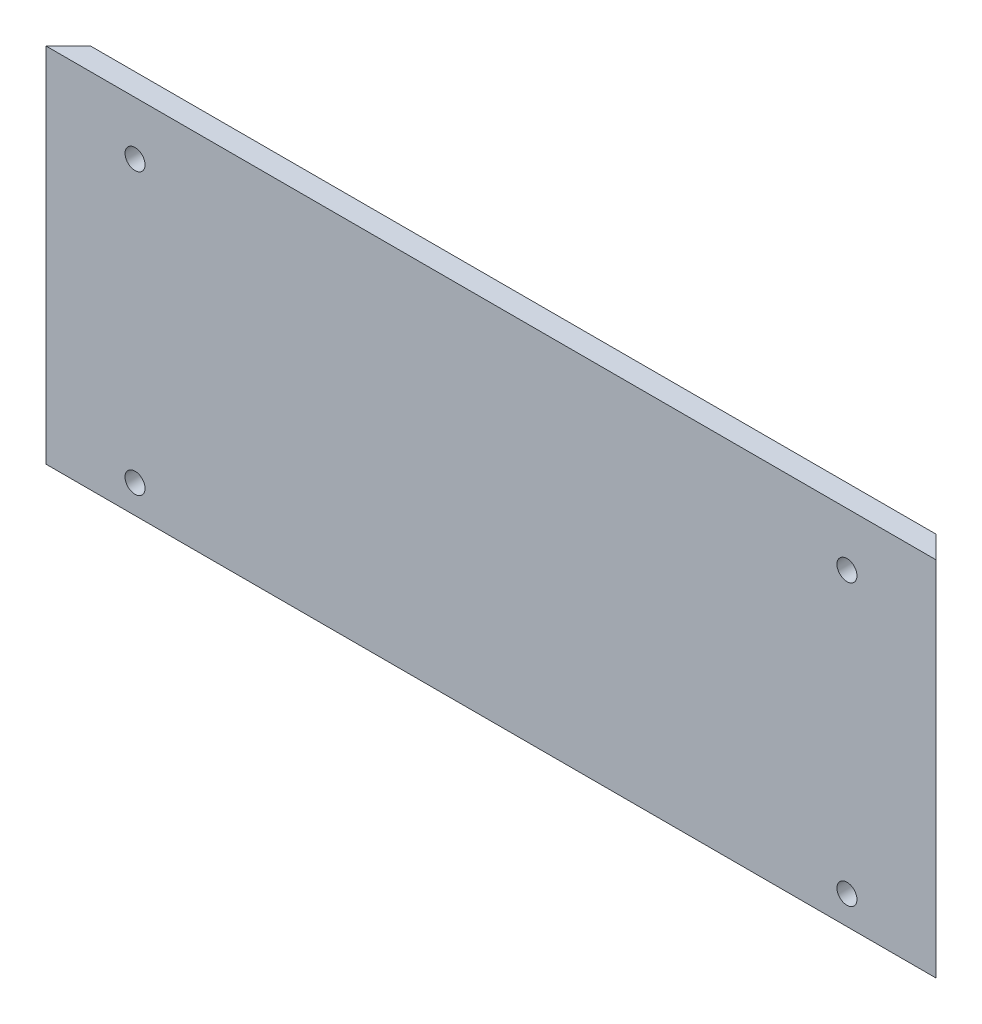
ISO-10303-21;
HEADER;
FILE_DESCRIPTION(('STEP AP214'),'2;1');
FILE_NAME('part.step','',(''),(''),'','','');
FILE_SCHEMA(('AUTOMOTIVE_DESIGN { 1 0 10303 214 1 1 1 1 }'));
ENDSEC;
DATA;
#1=APPLICATION_CONTEXT('core data for automotive mechanical design processes');
#2=APPLICATION_PROTOCOL_DEFINITION('international standard','automotive_design',2000,#1);
#3=PRODUCT_CONTEXT('',#1,'mechanical');
#4=PRODUCT('Part','Part','',(#3));
#5=PRODUCT_RELATED_PRODUCT_CATEGORY('part','',(#4));
#6=PRODUCT_DEFINITION_FORMATION('','',#4);
#7=PRODUCT_DEFINITION_CONTEXT('part definition',#1,'design');
#8=PRODUCT_DEFINITION('design','',#6,#7);
#9=PRODUCT_DEFINITION_SHAPE('','',#8);
#10=(LENGTH_UNIT() NAMED_UNIT(*) SI_UNIT(.MILLI.,.METRE.));
#11=(NAMED_UNIT(*) PLANE_ANGLE_UNIT() SI_UNIT($,.RADIAN.));
#12=(NAMED_UNIT(*) SI_UNIT($,.STERADIAN.) SOLID_ANGLE_UNIT());
#13=UNCERTAINTY_MEASURE_WITH_UNIT(LENGTH_MEASURE(1.E-05),#10,'distance_accuracy_value','');
#14=(GEOMETRIC_REPRESENTATION_CONTEXT(3) GLOBAL_UNCERTAINTY_ASSIGNED_CONTEXT((#13)) GLOBAL_UNIT_ASSIGNED_CONTEXT((#10,
#11,#12)) REPRESENTATION_CONTEXT('',''));
#15=CARTESIAN_POINT('',(0.,0.,0.));
#16=DIRECTION('',(0.,0.,1.));
#17=DIRECTION('',(1.,0.,0.));
#18=AXIS2_PLACEMENT_3D('',#15,#16,#17);
#19=CARTESIAN_POINT('',(0.,84.,-5.));
#20=DIRECTION('',(0.,1.,0.));
#21=DIRECTION('',(0.,0.,1.));
#22=AXIS2_PLACEMENT_3D('',#19,#20,#21);
#23=PLANE('',#22);
#24=DIRECTION('',(-0.707106781186546,0.,-0.707106781186549));
#25=VECTOR('',#24,1.);
#26=CARTESIAN_POINT('',(97.5000000000003,84.,-102.5));
#27=LINE('',#26,#25);
#28=CARTESIAN_POINT('',(200.,84.,0.));
#29=VERTEX_POINT('',#28);
#30=CARTESIAN_POINT('',(195.,84.,-4.99999999999998));
#31=VERTEX_POINT('',#30);
#32=EDGE_CURVE('E129',#29,#31,#27,.T.);
#33=ORIENTED_EDGE('',*,*,#32,.T.);
#34=DIRECTION('',(-1.,0.,0.));
#35=VECTOR('',#34,1.);
#36=CARTESIAN_POINT('',(8.00000000000001,84.,-5.));
#37=LINE('',#36,#35);
#38=CARTESIAN_POINT('',(5.00000000000002,84.,-5.));
#39=VERTEX_POINT('',#38);
#40=EDGE_CURVE('E65',#31,#39,#37,.T.);
#41=ORIENTED_EDGE('',*,*,#40,.T.);
#42=DIRECTION('',(-0.707106781186546,0.,0.707106781186549));
#43=VECTOR('',#42,1.);
#44=CARTESIAN_POINT('',(2.50000000000002,84.,-2.49999999999999));
#45=LINE('',#44,#43);
#46=CARTESIAN_POINT('',(0.,84.,0.));
#47=VERTEX_POINT('',#46);
#48=EDGE_CURVE('E124',#39,#47,#45,.T.);
#49=ORIENTED_EDGE('',*,*,#48,.T.);
#50=DIRECTION('',(-1.,0.,0.));
#51=VECTOR('',#50,1.);
#52=CARTESIAN_POINT('',(0.,84.,0.));
#53=LINE('',#52,#51);
#54=EDGE_CURVE('E165',#29,#47,#53,.T.);
#55=ORIENTED_EDGE('',*,*,#54,.F.);
#56=EDGE_LOOP('',(#33,#41,#49,#55));
#57=FACE_BOUND('',#56,.T.);
#58=ADVANCED_FACE('F41',(#57),#23,.T.);
#59=CARTESIAN_POINT('',(0.,0.,-5.));
#60=DIRECTION('',(0.,0.,-1.));
#61=DIRECTION('',(-1.,0.,0.));
#62=AXIS2_PLACEMENT_3D('',#59,#60,#61);
#63=PLANE('',#62);
#64=DIRECTION('',(1.,0.,0.));
#65=VECTOR('',#64,1.);
#66=CARTESIAN_POINT('',(-5.,2.59999999999993,-4.99999999999971));
#67=LINE('',#66,#65);
#68=CARTESIAN_POINT('',(4.99999999999973,2.59999999999993,-4.99999999999971));
#69=VERTEX_POINT('',#68);
#70=CARTESIAN_POINT('',(195.,2.59999999999993,-4.99999999999971));
#71=VERTEX_POINT('',#70);
#72=EDGE_CURVE('E100',#69,#71,#67,.T.);
#73=ORIENTED_EDGE('',*,*,#72,.F.);
#74=DIRECTION('',(0.,1.,0.));
#75=VECTOR('',#74,1.);
#76=CARTESIAN_POINT('',(5.00000000000002,0.,-5.));
#77=LINE('',#76,#75);
#78=CARTESIAN_POINT('',(5.00000000000002,5.,-5.));
#79=VERTEX_POINT('',#78);
#80=EDGE_CURVE('E125',#69,#79,#77,.T.);
#81=ORIENTED_EDGE('',*,*,#80,.T.);
#82=DIRECTION('',(-1.,0.,0.));
#83=VECTOR('',#82,1.);
#84=CARTESIAN_POINT('',(0.,5.,-5.));
#85=LINE('',#84,#83);
#86=CARTESIAN_POINT('',(195.,4.99999999999996,-5.));
#87=VERTEX_POINT('',#86);
#88=EDGE_CURVE('E122',#87,#79,#85,.T.);
#89=ORIENTED_EDGE('',*,*,#88,.F.);
#90=DIRECTION('',(0.,-1.,0.));
#91=VECTOR('',#90,1.);
#92=CARTESIAN_POINT('',(195.,0.,-5.));
#93=LINE('',#92,#91);
#94=EDGE_CURVE('E114',#87,#71,#93,.T.);
#95=ORIENTED_EDGE('',*,*,#94,.T.);
#96=EDGE_LOOP('',(#73,#81,#89,#95));
#97=FACE_BOUND('',#96,.T.);
#98=ADVANCED_FACE('F120',(#97),#63,.T.);
#99=CARTESIAN_POINT('',(0.,0.,0.));
#100=DIRECTION('',(0.,0.,-1.));
#101=DIRECTION('',(-1.,0.,0.));
#102=AXIS2_PLACEMENT_3D('',#99,#100,#101);
#103=PLANE('',#102);
#104=CARTESIAN_POINT('',(180.,72.,0.));
#105=DIRECTION('',(0.,0.,1.));
#106=DIRECTION('',(-1.,0.,0.));
#107=AXIS2_PLACEMENT_3D('',#104,#105,#106);
#108=CIRCLE('',#107,2.25000000000001);
#109=CARTESIAN_POINT('',(177.75,72.,0.));
#110=VERTEX_POINT('',#109);
#111=EDGE_CURVE('E186',#110,#110,#108,.T.);
#112=ORIENTED_EDGE('',*,*,#111,.F.);
#113=EDGE_LOOP('',(#112));
#114=FACE_BOUND('',#113,.T.);
#115=CARTESIAN_POINT('',(20.,72.,0.));
#116=DIRECTION('',(0.,0.,1.));
#117=DIRECTION('',(1.,0.,0.));
#118=AXIS2_PLACEMENT_3D('',#115,#116,#117);
#119=CIRCLE('',#118,2.25);
#120=CARTESIAN_POINT('',(22.25,72.,0.));
#121=VERTEX_POINT('',#120);
#122=EDGE_CURVE('E191',#121,#121,#119,.T.);
#123=ORIENTED_EDGE('',*,*,#122,.F.);
#124=EDGE_LOOP('',(#123));
#125=FACE_BOUND('',#124,.T.);
#126=CARTESIAN_POINT('',(180.,9.,0.));
#127=DIRECTION('',(0.,0.,1.));
#128=DIRECTION('',(-1.,0.,0.));
#129=AXIS2_PLACEMENT_3D('',#126,#127,#128);
#130=CIRCLE('',#129,2.25000000000001);
#131=CARTESIAN_POINT('',(177.75,9.,0.));
#132=VERTEX_POINT('',#131);
#133=EDGE_CURVE('E201',#132,#132,#130,.T.);
#134=ORIENTED_EDGE('',*,*,#133,.F.);
#135=EDGE_LOOP('',(#134));
#136=FACE_BOUND('',#135,.T.);
#137=CARTESIAN_POINT('',(20.,9.,0.));
#138=DIRECTION('',(0.,0.,1.));
#139=DIRECTION('',(1.,0.,0.));
#140=AXIS2_PLACEMENT_3D('',#137,#138,#139);
#141=CIRCLE('',#140,2.25);
#142=CARTESIAN_POINT('',(22.25,9.,0.));
#143=VERTEX_POINT('',#142);
#144=EDGE_CURVE('E205',#143,#143,#141,.T.);
#145=ORIENTED_EDGE('',*,*,#144,.F.);
#146=EDGE_LOOP('',(#145));
#147=FACE_BOUND('',#146,.T.);
#148=DIRECTION('',(0.,-1.,0.));
#149=VECTOR('',#148,1.);
#150=CARTESIAN_POINT('',(0.,0.,0.));
#151=LINE('',#150,#149);
#152=CARTESIAN_POINT('',(0.,2.59999999999993,0.));
#153=VERTEX_POINT('',#152);
#154=EDGE_CURVE('E174',#47,#153,#151,.T.);
#155=ORIENTED_EDGE('',*,*,#154,.T.);
#156=DIRECTION('',(1.,0.,0.));
#157=VECTOR('',#156,1.);
#158=CARTESIAN_POINT('',(0.,2.59999999999993,3.33066907387547E-13));
#159=LINE('',#158,#157);
#160=CARTESIAN_POINT('',(200.,2.59999999999993,3.33066907387547E-13));
#161=VERTEX_POINT('',#160);
#162=EDGE_CURVE('E57',#153,#161,#159,.T.);
#163=ORIENTED_EDGE('',*,*,#162,.T.);
#164=DIRECTION('',(0.,1.,0.));
#165=VECTOR('',#164,1.);
#166=CARTESIAN_POINT('',(200.,0.,0.));
#167=LINE('',#166,#165);
#168=EDGE_CURVE('E116',#161,#29,#167,.T.);
#169=ORIENTED_EDGE('',*,*,#168,.T.);
#170=ORIENTED_EDGE('',*,*,#54,.T.);
#171=EDGE_LOOP('',(#155,#163,#169,#170));
#172=FACE_BOUND('',#171,.T.);
#173=ADVANCED_FACE('F209',(#114,#125,#136,#147,#172),#103,.F.);
#174=CARTESIAN_POINT('',(20.,9.,-5.));
#175=DIRECTION('',(0.,0.,1.));
#176=DIRECTION('',(1.,0.,0.));
#177=AXIS2_PLACEMENT_3D('',#174,#175,#176);
#178=CYLINDRICAL_SURFACE('',#177,2.25);
#179=ORIENTED_EDGE('',*,*,#144,.T.);
#180=EDGE_LOOP('',(#179));
#181=FACE_BOUND('',#180,.T.);
#182=CARTESIAN_POINT('',(20.,9.,-8.));
#183=DIRECTION('',(0.,0.,-1.));
#184=DIRECTION('',(-1.,0.,0.));
#185=AXIS2_PLACEMENT_3D('',#182,#183,#184);
#186=CIRCLE('',#185,2.25);
#187=CARTESIAN_POINT('',(17.75,9.,-8.));
#188=VERTEX_POINT('',#187);
#189=EDGE_CURVE('E220',#188,#188,#186,.T.);
#190=ORIENTED_EDGE('',*,*,#189,.T.);
#191=EDGE_LOOP('',(#190));
#192=FACE_BOUND('',#191,.T.);
#193=ADVANCED_FACE('F314',(#181,#192),#178,.F.);
#194=CARTESIAN_POINT('',(180.,9.,-5.));
#195=DIRECTION('',(0.,0.,1.));
#196=DIRECTION('',(1.,0.,0.));
#197=AXIS2_PLACEMENT_3D('',#194,#195,#196);
#198=CYLINDRICAL_SURFACE('',#197,2.25000000000001);
#199=ORIENTED_EDGE('',*,*,#133,.T.);
#200=EDGE_LOOP('',(#199));
#201=FACE_BOUND('',#200,.T.);
#202=CARTESIAN_POINT('',(180.,9.,-8.));
#203=DIRECTION('',(0.,0.,-1.));
#204=DIRECTION('',(-1.,0.,0.));
#205=AXIS2_PLACEMENT_3D('',#202,#203,#204);
#206=CIRCLE('',#205,2.25000000000001);
#207=CARTESIAN_POINT('',(177.75,9.,-8.));
#208=VERTEX_POINT('',#207);
#209=EDGE_CURVE('E215',#208,#208,#206,.T.);
#210=ORIENTED_EDGE('',*,*,#209,.T.);
#211=EDGE_LOOP('',(#210));
#212=FACE_BOUND('',#211,.T.);
#213=ADVANCED_FACE('F245',(#201,#212),#198,.F.);
#214=CARTESIAN_POINT('',(20.,72.,-5.));
#215=DIRECTION('',(0.,0.,1.));
#216=DIRECTION('',(1.,0.,0.));
#217=AXIS2_PLACEMENT_3D('',#214,#215,#216);
#218=CYLINDRICAL_SURFACE('',#217,2.25);
#219=ORIENTED_EDGE('',*,*,#122,.T.);
#220=EDGE_LOOP('',(#219));
#221=FACE_BOUND('',#220,.T.);
#222=CARTESIAN_POINT('',(20.,72.,-8.));
#223=DIRECTION('',(0.,0.,-1.));
#224=DIRECTION('',(-1.,0.,0.));
#225=AXIS2_PLACEMENT_3D('',#222,#223,#224);
#226=CIRCLE('',#225,2.25000000000001);
#227=CARTESIAN_POINT('',(17.75,72.,-8.));
#228=VERTEX_POINT('',#227);
#229=EDGE_CURVE('E193',#228,#228,#226,.T.);
#230=ORIENTED_EDGE('',*,*,#229,.T.);
#231=EDGE_LOOP('',(#230));
#232=FACE_BOUND('',#231,.T.);
#233=ADVANCED_FACE('F229',(#221,#232),#218,.F.);
#234=CARTESIAN_POINT('',(180.,72.,-5.));
#235=DIRECTION('',(0.,0.,1.));
#236=DIRECTION('',(1.,0.,0.));
#237=AXIS2_PLACEMENT_3D('',#234,#235,#236);
#238=CYLINDRICAL_SURFACE('',#237,2.25000000000001);
#239=ORIENTED_EDGE('',*,*,#111,.T.);
#240=EDGE_LOOP('',(#239));
#241=FACE_BOUND('',#240,.T.);
#242=CARTESIAN_POINT('',(180.,72.,-8.));
#243=DIRECTION('',(0.,0.,-1.));
#244=DIRECTION('',(-1.,0.,0.));
#245=AXIS2_PLACEMENT_3D('',#242,#243,#244);
#246=CIRCLE('',#245,2.25000000000001);
#247=CARTESIAN_POINT('',(177.75,72.,-8.));
#248=VERTEX_POINT('',#247);
#249=EDGE_CURVE('E211',#248,#248,#246,.T.);
#250=ORIENTED_EDGE('',*,*,#249,.T.);
#251=EDGE_LOOP('',(#250));
#252=FACE_BOUND('',#251,.T.);
#253=ADVANCED_FACE('F232',(#241,#252),#238,.F.);
#254=CARTESIAN_POINT('',(0.,0.,-8.));
#255=DIRECTION('',(0.,0.,1.));
#256=DIRECTION('',(1.,0.,0.));
#257=AXIS2_PLACEMENT_3D('',#254,#255,#256);
#258=PLANE('',#257);
#259=DIRECTION('',(0.,1.,0.));
#260=VECTOR('',#259,1.);
#261=CARTESIAN_POINT('',(8.00000000000001,84.,-8.));
#262=LINE('',#261,#260);
#263=CARTESIAN_POINT('',(8.00000000000001,5.,-8.));
#264=VERTEX_POINT('',#263);
#265=CARTESIAN_POINT('',(8.00000000000001,81.,-8.));
#266=VERTEX_POINT('',#265);
#267=EDGE_CURVE('E152',#264,#266,#262,.T.);
#268=ORIENTED_EDGE('',*,*,#267,.T.);
#269=DIRECTION('',(1.,0.,0.));
#270=VECTOR('',#269,1.);
#271=CARTESIAN_POINT('',(192.,81.,-8.));
#272=LINE('',#271,#270);
#273=CARTESIAN_POINT('',(192.,81.,-8.));
#274=VERTEX_POINT('',#273);
#275=EDGE_CURVE('E137',#266,#274,#272,.T.);
#276=ORIENTED_EDGE('',*,*,#275,.T.);
#277=DIRECTION('',(0.,-1.,0.));
#278=VECTOR('',#277,1.);
#279=CARTESIAN_POINT('',(192.,4.99999999999996,-8.));
#280=LINE('',#279,#278);
#281=CARTESIAN_POINT('',(192.,4.99999999999997,-8.));
#282=VERTEX_POINT('',#281);
#283=EDGE_CURVE('E164',#274,#282,#280,.T.);
#284=ORIENTED_EDGE('',*,*,#283,.T.);
#285=DIRECTION('',(-1.,0.,0.));
#286=VECTOR('',#285,1.);
#287=CARTESIAN_POINT('',(0.,5.,-8.));
#288=LINE('',#287,#286);
#289=EDGE_CURVE('E162',#282,#264,#288,.T.);
#290=ORIENTED_EDGE('',*,*,#289,.T.);
#291=EDGE_LOOP('',(#268,#276,#284,#290));
#292=FACE_BOUND('',#291,.T.);
#293=ORIENTED_EDGE('',*,*,#229,.F.);
#294=EDGE_LOOP('',(#293));
#295=FACE_BOUND('',#294,.T.);
#296=ORIENTED_EDGE('',*,*,#189,.F.);
#297=EDGE_LOOP('',(#296));
#298=FACE_BOUND('',#297,.T.);
#299=ORIENTED_EDGE('',*,*,#209,.F.);
#300=EDGE_LOOP('',(#299));
#301=FACE_BOUND('',#300,.T.);
#302=ORIENTED_EDGE('',*,*,#249,.F.);
#303=EDGE_LOOP('',(#302));
#304=FACE_BOUND('',#303,.T.);
#305=ADVANCED_FACE('F158',(#292,#295,#298,#301,#304),#258,.F.);
#306=CARTESIAN_POINT('',(0.,5.,-8.));
#307=DIRECTION('',(0.,1.,0.));
#308=DIRECTION('',(-1.,0.,0.));
#309=AXIS2_PLACEMENT_3D('',#306,#307,#308);
#310=PLANE('',#309);
#311=ORIENTED_EDGE('',*,*,#289,.F.);
#312=DIRECTION('',(0.707106781186546,0.,0.707106781186549));
#313=VECTOR('',#312,1.);
#314=CARTESIAN_POINT('',(192.,4.99999999999997,-8.));
#315=LINE('',#314,#313);
#316=EDGE_CURVE('E131',#282,#87,#315,.T.);
#317=ORIENTED_EDGE('',*,*,#316,.T.);
#318=ORIENTED_EDGE('',*,*,#88,.T.);
#319=DIRECTION('',(0.707106781186546,0.,-0.707106781186549));
#320=VECTOR('',#319,1.);
#321=CARTESIAN_POINT('',(8.00000000000001,5.,-8.));
#322=LINE('',#321,#320);
#323=EDGE_CURVE('E180',#79,#264,#322,.T.);
#324=ORIENTED_EDGE('',*,*,#323,.T.);
#325=EDGE_LOOP('',(#311,#317,#318,#324));
#326=FACE_BOUND('',#325,.T.);
#327=ADVANCED_FACE('F184',(#326),#310,.F.);
#328=CARTESIAN_POINT('',(192.,0.,-8.));
#329=DIRECTION('',(0.707106781186549,0.,-0.707106781186546));
#330=DIRECTION('',(0.,1.,0.));
#331=AXIS2_PLACEMENT_3D('',#328,#329,#330);
#332=PLANE('',#331);
#333=DIRECTION('',(0.707106781186544,0.,0.70710678118655));
#334=VECTOR('',#333,1.);
#335=CARTESIAN_POINT('',(200.,2.59999999999993,3.33066907387547E-13));
#336=LINE('',#335,#334);
#337=EDGE_CURVE('E103',#71,#161,#336,.T.);
#338=ORIENTED_EDGE('',*,*,#337,.F.);
#339=ORIENTED_EDGE('',*,*,#94,.F.);
#340=ORIENTED_EDGE('',*,*,#316,.F.);
#341=ORIENTED_EDGE('',*,*,#283,.F.);
#342=DIRECTION('',(0.577350269189624,0.577350269189627,0.577350269189626));
#343=VECTOR('',#342,1.);
#344=CARTESIAN_POINT('',(165.,53.9999999999999,-35.0000000000001));
#345=LINE('',#344,#343);
#346=EDGE_CURVE('E141',#274,#31,#345,.T.);
#347=ORIENTED_EDGE('',*,*,#346,.T.);
#348=ORIENTED_EDGE('',*,*,#32,.F.);
#349=ORIENTED_EDGE('',*,*,#168,.F.);
#350=EDGE_LOOP('',(#338,#339,#340,#341,#347,#348,#349));
#351=FACE_BOUND('',#350,.T.);
#352=ADVANCED_FACE('F112',(#351),#332,.T.);
#353=CARTESIAN_POINT('',(8.00000000000001,0.,-8.));
#354=DIRECTION('',(-0.707106781186549,0.,-0.707106781186546));
#355=DIRECTION('',(0.,-1.,0.));
#356=AXIS2_PLACEMENT_3D('',#353,#354,#355);
#357=PLANE('',#356);
#358=DIRECTION('',(0.707106781186546,0.,-0.707106781186549));
#359=VECTOR('',#358,1.);
#360=CARTESIAN_POINT('',(8.00000000000001,2.59999999999993,-8.));
#361=LINE('',#360,#359);
#362=EDGE_CURVE('E11',#153,#69,#361,.T.);
#363=ORIENTED_EDGE('',*,*,#362,.F.);
#364=ORIENTED_EDGE('',*,*,#154,.F.);
#365=ORIENTED_EDGE('',*,*,#48,.F.);
#366=DIRECTION('',(0.577350269189624,-0.577350269189627,-0.577350269189626));
#367=VECTOR('',#366,1.);
#368=CARTESIAN_POINT('',(35.,53.9999999999999,-35.0000000000001));
#369=LINE('',#368,#367);
#370=EDGE_CURVE('E51',#39,#266,#369,.T.);
#371=ORIENTED_EDGE('',*,*,#370,.T.);
#372=ORIENTED_EDGE('',*,*,#267,.F.);
#373=ORIENTED_EDGE('',*,*,#323,.F.);
#374=ORIENTED_EDGE('',*,*,#80,.F.);
#375=EDGE_LOOP('',(#363,#364,#365,#371,#372,#373,#374));
#376=FACE_BOUND('',#375,.T.);
#377=ADVANCED_FACE('F150',(#376),#357,.T.);
#378=CARTESIAN_POINT('',(0.,81.,-8.));
#379=DIRECTION('',(0.,0.707106781186547,-0.707106781186548));
#380=DIRECTION('',(-1.,0.,0.));
#381=AXIS2_PLACEMENT_3D('',#378,#379,#380);
#382=PLANE('',#381);
#383=ORIENTED_EDGE('',*,*,#370,.F.);
#384=ORIENTED_EDGE('',*,*,#40,.F.);
#385=ORIENTED_EDGE('',*,*,#346,.F.);
#386=ORIENTED_EDGE('',*,*,#275,.F.);
#387=EDGE_LOOP('',(#383,#384,#385,#386));
#388=FACE_BOUND('',#387,.T.);
#389=ADVANCED_FACE('F44',(#388),#382,.T.);
#390=CARTESIAN_POINT('',(0.,2.59999999999993,3.33066907387547E-13));
#391=DIRECTION('',(0.,1.,0.));
#392=DIRECTION('',(-1.,0.,0.));
#393=AXIS2_PLACEMENT_3D('',#390,#391,#392);
#394=PLANE('',#393);
#395=ORIENTED_EDGE('',*,*,#362,.T.);
#396=ORIENTED_EDGE('',*,*,#72,.T.);
#397=ORIENTED_EDGE('',*,*,#337,.T.);
#398=ORIENTED_EDGE('',*,*,#162,.F.);
#399=EDGE_LOOP('',(#395,#396,#397,#398));
#400=FACE_BOUND('',#399,.T.);
#401=ADVANCED_FACE('F102',(#400),#394,.F.);
#402=CLOSED_SHELL('',(#58,#98,#173,#193,#213,#233,#253,#305,#327,#352,#377,#389,#401));
#403=MANIFOLD_SOLID_BREP('B2',#402);
#404=ADVANCED_BREP_SHAPE_REPRESENTATION('',(#18,#403),#14);
#405=SHAPE_DEFINITION_REPRESENTATION(#9,#404);
ENDSEC;
END-ISO-10303-21;
